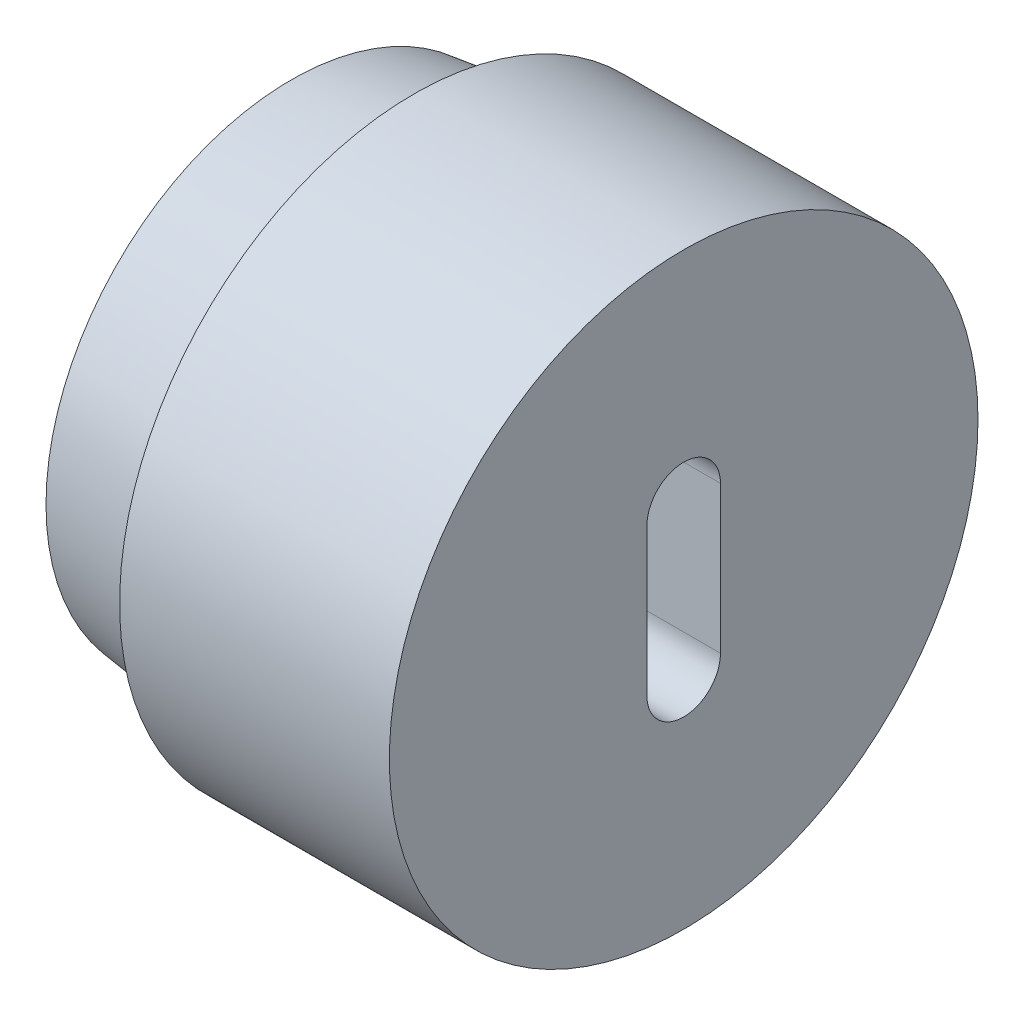
ISO-10303-21;
HEADER;
FILE_DESCRIPTION(('STEP AP214'),'2;1');
FILE_NAME('part.step','',(''),(''),'','','');
FILE_SCHEMA(('AUTOMOTIVE_DESIGN { 1 0 10303 214 1 1 1 1 }'));
ENDSEC;
DATA;
#1=APPLICATION_CONTEXT('core data for automotive mechanical design processes');
#2=APPLICATION_PROTOCOL_DEFINITION('international standard','automotive_design',2000,#1);
#3=PRODUCT_CONTEXT('',#1,'mechanical');
#4=PRODUCT('Part','Part','',(#3));
#5=PRODUCT_RELATED_PRODUCT_CATEGORY('part','',(#4));
#6=PRODUCT_DEFINITION_FORMATION('','',#4);
#7=PRODUCT_DEFINITION_CONTEXT('part definition',#1,'design');
#8=PRODUCT_DEFINITION('design','',#6,#7);
#9=PRODUCT_DEFINITION_SHAPE('','',#8);
#10=(LENGTH_UNIT() NAMED_UNIT(*) SI_UNIT(.MILLI.,.METRE.));
#11=(NAMED_UNIT(*) PLANE_ANGLE_UNIT() SI_UNIT($,.RADIAN.));
#12=(NAMED_UNIT(*) SI_UNIT($,.STERADIAN.) SOLID_ANGLE_UNIT());
#13=UNCERTAINTY_MEASURE_WITH_UNIT(LENGTH_MEASURE(1.E-05),#10,'distance_accuracy_value','');
#14=(GEOMETRIC_REPRESENTATION_CONTEXT(3) GLOBAL_UNCERTAINTY_ASSIGNED_CONTEXT((#13)) GLOBAL_UNIT_ASSIGNED_CONTEXT((#10,
#11,#12)) REPRESENTATION_CONTEXT('',''));
#15=CARTESIAN_POINT('',(0.,0.,0.));
#16=DIRECTION('',(0.,0.,1.));
#17=DIRECTION('',(1.,0.,0.));
#18=AXIS2_PLACEMENT_3D('',#15,#16,#17);
#19=CARTESIAN_POINT('',(0.,0.,0.));
#20=DIRECTION('',(1.,0.,0.));
#21=DIRECTION('',(0.,0.,-1.));
#22=AXIS2_PLACEMENT_3D('',#19,#20,#21);
#23=PLANE('',#22);
#24=CARTESIAN_POINT('',(0.,-1.5,0.));
#25=DIRECTION('',(1.,0.,0.));
#26=DIRECTION('',(0.,0.,-1.));
#27=AXIS2_PLACEMENT_3D('',#24,#25,#26);
#28=CIRCLE('',#27,0.75);
#29=CARTESIAN_POINT('',(0.,-1.5,0.75));
#30=VERTEX_POINT('',#29);
#31=CARTESIAN_POINT('',(0.,-1.5,-0.75));
#32=VERTEX_POINT('',#31);
#33=EDGE_CURVE('E364',#30,#32,#28,.T.);
#34=ORIENTED_EDGE('',*,*,#33,.F.);
#35=DIRECTION('',(0.,-1.,0.));
#36=VECTOR('',#35,1.);
#37=CARTESIAN_POINT('',(0.,-1.5,0.75));
#38=LINE('',#37,#36);
#39=CARTESIAN_POINT('',(0.,1.5,0.75));
#40=VERTEX_POINT('',#39);
#41=EDGE_CURVE('E411',#40,#30,#38,.T.);
#42=ORIENTED_EDGE('',*,*,#41,.F.);
#43=CARTESIAN_POINT('',(0.,1.5,0.));
#44=DIRECTION('',(1.,0.,0.));
#45=DIRECTION('',(0.,0.,-1.));
#46=AXIS2_PLACEMENT_3D('',#43,#44,#45);
#47=CIRCLE('',#46,0.75);
#48=CARTESIAN_POINT('',(0.,1.5,-0.75));
#49=VERTEX_POINT('',#48);
#50=EDGE_CURVE('E395',#49,#40,#47,.T.);
#51=ORIENTED_EDGE('',*,*,#50,.F.);
#52=DIRECTION('',(0.,1.,0.));
#53=VECTOR('',#52,1.);
#54=CARTESIAN_POINT('',(0.,-1.5,-0.75));
#55=LINE('',#54,#53);
#56=EDGE_CURVE('E406',#32,#49,#55,.T.);
#57=ORIENTED_EDGE('',*,*,#56,.F.);
#58=EDGE_LOOP('',(#34,#42,#51,#57));
#59=FACE_BOUND('',#58,.T.);
#60=CARTESIAN_POINT('',(0.,0.,0.));
#61=DIRECTION('',(1.,0.,0.));
#62=DIRECTION('',(0.,0.,-1.));
#63=AXIS2_PLACEMENT_3D('',#60,#61,#62);
#64=CIRCLE('',#63,5.99999999999999);
#65=CARTESIAN_POINT('',(0.,0.,-5.99999999999999));
#66=VERTEX_POINT('',#65);
#67=EDGE_CURVE('E11',#66,#66,#64,.T.);
#68=ORIENTED_EDGE('',*,*,#67,.T.);
#69=EDGE_LOOP('',(#68));
#70=FACE_BOUND('',#69,.T.);
#71=ADVANCED_FACE('F350',(#59,#70),#23,.T.);
#72=CARTESIAN_POINT('',(3.08877382218987,0.,0.));
#73=DIRECTION('',(1.,0.,0.));
#74=DIRECTION('',(0.,0.,-1.));
#75=AXIS2_PLACEMENT_3D('',#72,#73,#74);
#76=CYLINDRICAL_SURFACE('',#75,6.);
#77=CARTESIAN_POINT('',(-5.5,0.,0.));
#78=DIRECTION('',(1.,0.,0.));
#79=DIRECTION('',(0.,0.,-1.));
#80=AXIS2_PLACEMENT_3D('',#77,#78,#79);
#81=CIRCLE('',#80,6.);
#82=CARTESIAN_POINT('',(-5.5,0.,-6.));
#83=VERTEX_POINT('',#82);
#84=EDGE_CURVE('E357',#83,#83,#81,.T.);
#85=ORIENTED_EDGE('',*,*,#84,.T.);
#86=EDGE_LOOP('',(#85));
#87=FACE_BOUND('',#86,.T.);
#88=ORIENTED_EDGE('',*,*,#67,.F.);
#89=EDGE_LOOP('',(#88));
#90=FACE_BOUND('',#89,.T.);
#91=ADVANCED_FACE('F448',(#87,#90),#76,.T.);
#92=CARTESIAN_POINT('',(-5.5,0.,0.));
#93=DIRECTION('',(1.,0.,0.));
#94=DIRECTION('',(0.,0.,-1.));
#95=AXIS2_PLACEMENT_3D('',#92,#93,#94);
#96=CONICAL_SURFACE('',#95,6.,0.98279372324733);
#97=CARTESIAN_POINT('',(-6.,0.,0.));
#98=DIRECTION('',(1.,0.,0.));
#99=DIRECTION('',(0.,0.,-1.));
#100=AXIS2_PLACEMENT_3D('',#97,#98,#99);
#101=CIRCLE('',#100,5.25);
#102=CARTESIAN_POINT('',(-6.,0.,-5.25));
#103=VERTEX_POINT('',#102);
#104=EDGE_CURVE('E443',#103,#103,#101,.T.);
#105=ORIENTED_EDGE('',*,*,#104,.T.);
#106=EDGE_LOOP('',(#105));
#107=FACE_BOUND('',#106,.T.);
#108=ORIENTED_EDGE('',*,*,#84,.F.);
#109=EDGE_LOOP('',(#108));
#110=FACE_BOUND('',#109,.T.);
#111=ADVANCED_FACE('F451',(#107,#110),#96,.T.);
#112=CARTESIAN_POINT('',(-6.,0.,0.));
#113=DIRECTION('',(1.,0.,0.));
#114=DIRECTION('',(0.,0.,-1.));
#115=AXIS2_PLACEMENT_3D('',#112,#113,#114);
#116=CONICAL_SURFACE('',#115,5.25,0.124354994546762);
#117=CARTESIAN_POINT('',(-8.,0.,0.));
#118=DIRECTION('',(1.,0.,0.));
#119=DIRECTION('',(0.,0.,-1.));
#120=AXIS2_PLACEMENT_3D('',#117,#118,#119);
#121=CIRCLE('',#120,5.);
#122=CARTESIAN_POINT('',(-8.,0.,-5.));
#123=VERTEX_POINT('',#122);
#124=EDGE_CURVE('E440',#123,#123,#121,.T.);
#125=ORIENTED_EDGE('',*,*,#124,.T.);
#126=EDGE_LOOP('',(#125));
#127=FACE_BOUND('',#126,.T.);
#128=ORIENTED_EDGE('',*,*,#104,.F.);
#129=EDGE_LOOP('',(#128));
#130=FACE_BOUND('',#129,.T.);
#131=ADVANCED_FACE('F453',(#127,#130),#116,.T.);
#132=CARTESIAN_POINT('',(-8.,5.,0.));
#133=DIRECTION('',(-1.,0.,0.));
#134=DIRECTION('',(0.,0.,1.));
#135=AXIS2_PLACEMENT_3D('',#132,#133,#134);
#136=PLANE('',#135);
#137=CARTESIAN_POINT('',(-8.,0.,0.));
#138=DIRECTION('',(1.,0.,0.));
#139=DIRECTION('',(0.,0.,-1.));
#140=AXIS2_PLACEMENT_3D('',#137,#138,#139);
#141=CIRCLE('',#140,3.62462112512354);
#142=CARTESIAN_POINT('',(-8.,0.,-3.62462112512354));
#143=VERTEX_POINT('',#142);
#144=EDGE_CURVE('E437',#143,#143,#141,.T.);
#145=ORIENTED_EDGE('',*,*,#144,.T.);
#146=EDGE_LOOP('',(#145));
#147=FACE_BOUND('',#146,.T.);
#148=ORIENTED_EDGE('',*,*,#124,.F.);
#149=EDGE_LOOP('',(#148));
#150=FACE_BOUND('',#149,.T.);
#151=ADVANCED_FACE('F460',(#147,#150),#136,.T.);
#152=CARTESIAN_POINT('',(-7.2,0.,0.));
#153=DIRECTION('',(1.,0.,0.));
#154=DIRECTION('',(0.,0.,-1.));
#155=AXIS2_PLACEMENT_3D('',#152,#153,#154);
#156=TOROIDAL_SURFACE('',#155,3.62462112512353,0.8);
#157=CARTESIAN_POINT('',(-7.39402850002906,0.,0.));
#158=DIRECTION('',(1.,0.,0.));
#159=DIRECTION('',(0.,0.,-1.));
#160=AXIS2_PLACEMENT_3D('',#157,#158,#159);
#161=CIRCLE('',#160,2.84850712500726);
#162=CARTESIAN_POINT('',(-7.39402850002906,0.,-2.84850712500726));
#163=VERTEX_POINT('',#162);
#164=EDGE_CURVE('E434',#163,#163,#161,.T.);
#165=ORIENTED_EDGE('',*,*,#164,.T.);
#166=EDGE_LOOP('',(#165));
#167=FACE_BOUND('',#166,.T.);
#168=ORIENTED_EDGE('',*,*,#144,.F.);
#169=EDGE_LOOP('',(#168));
#170=FACE_BOUND('',#169,.T.);
#171=ADVANCED_FACE('F517',(#167,#170),#156,.T.);
#172=CARTESIAN_POINT('',(-7.39402850002906,0.,0.));
#173=DIRECTION('',(-1.,0.,0.));
#174=DIRECTION('',(0.,0.,1.));
#175=AXIS2_PLACEMENT_3D('',#172,#173,#174);
#176=CONICAL_SURFACE('',#175,2.84850712500726,0.244978663126864);
#177=CARTESIAN_POINT('',(-6.30298574998547,0.,0.));
#178=DIRECTION('',(1.,0.,0.));
#179=DIRECTION('',(0.,0.,-1.));
#180=AXIS2_PLACEMENT_3D('',#177,#178,#179);
#181=CIRCLE('',#180,2.57574643749637);
#182=CARTESIAN_POINT('',(-6.30298574998547,0.,-2.57574643749637));
#183=VERTEX_POINT('',#182);
#184=EDGE_CURVE('E431',#183,#183,#181,.T.);
#185=ORIENTED_EDGE('',*,*,#184,.T.);
#186=EDGE_LOOP('',(#185));
#187=FACE_BOUND('',#186,.T.);
#188=ORIENTED_EDGE('',*,*,#164,.F.);
#189=EDGE_LOOP('',(#188));
#190=FACE_BOUND('',#189,.T.);
#191=ADVANCED_FACE('F513',(#187,#190),#176,.F.);
#192=CARTESIAN_POINT('',(-6.4,0.,0.));
#193=DIRECTION('',(1.,0.,0.));
#194=DIRECTION('',(0.,0.,-1.));
#195=AXIS2_PLACEMENT_3D('',#192,#193,#194);
#196=TOROIDAL_SURFACE('',#195,2.18768943743823,0.4);
#197=CARTESIAN_POINT('',(-6.,0.,0.));
#198=DIRECTION('',(1.,0.,0.));
#199=DIRECTION('',(0.,0.,-1.));
#200=AXIS2_PLACEMENT_3D('',#197,#198,#199);
#201=CIRCLE('',#200,2.18768943743823);
#202=CARTESIAN_POINT('',(-6.,0.,-2.18768943743823));
#203=VERTEX_POINT('',#202);
#204=EDGE_CURVE('E426',#203,#203,#201,.T.);
#205=ORIENTED_EDGE('',*,*,#204,.T.);
#206=EDGE_LOOP('',(#205));
#207=FACE_BOUND('',#206,.T.);
#208=ORIENTED_EDGE('',*,*,#184,.F.);
#209=EDGE_LOOP('',(#208));
#210=FACE_BOUND('',#209,.T.);
#211=ADVANCED_FACE('F510',(#207,#210),#196,.F.);
#212=CARTESIAN_POINT('',(-6.,2.18768943743823,0.));
#213=DIRECTION('',(-1.,0.,0.));
#214=DIRECTION('',(0.,0.,1.));
#215=AXIS2_PLACEMENT_3D('',#212,#213,#214);
#216=PLANE('',#215);
#217=ORIENTED_EDGE('',*,*,#204,.F.);
#218=EDGE_LOOP('',(#217));
#219=FACE_BOUND('',#218,.T.);
#220=ADVANCED_FACE('F471',(#219),#216,.T.);
#221=CARTESIAN_POINT('',(-2.,-1.5,0.));
#222=DIRECTION('',(1.,0.,0.));
#223=DIRECTION('',(0.,0.,-1.));
#224=AXIS2_PLACEMENT_3D('',#221,#222,#223);
#225=CYLINDRICAL_SURFACE('',#224,0.75);
#226=ORIENTED_EDGE('',*,*,#33,.T.);
#227=DIRECTION('',(1.,0.,0.));
#228=VECTOR('',#227,1.);
#229=CARTESIAN_POINT('',(-2.,-1.5,-0.75));
#230=LINE('',#229,#228);
#231=CARTESIAN_POINT('',(-2.,-1.5,-0.75));
#232=VERTEX_POINT('',#231);
#233=EDGE_CURVE('E403',#232,#32,#230,.T.);
#234=ORIENTED_EDGE('',*,*,#233,.F.);
#235=CARTESIAN_POINT('',(-2.,-1.5,0.));
#236=DIRECTION('',(1.,0.,0.));
#237=DIRECTION('',(0.,0.,-1.));
#238=AXIS2_PLACEMENT_3D('',#235,#236,#237);
#239=CIRCLE('',#238,0.75);
#240=CARTESIAN_POINT('',(-2.,-1.5,0.75));
#241=VERTEX_POINT('',#240);
#242=EDGE_CURVE('E413',#241,#232,#239,.T.);
#243=ORIENTED_EDGE('',*,*,#242,.F.);
#244=DIRECTION('',(1.,0.,0.));
#245=VECTOR('',#244,1.);
#246=CARTESIAN_POINT('',(-2.,-1.5,0.75));
#247=LINE('',#246,#245);
#248=EDGE_CURVE('E371',#241,#30,#247,.T.);
#249=ORIENTED_EDGE('',*,*,#248,.T.);
#250=EDGE_LOOP('',(#226,#234,#243,#249));
#251=FACE_BOUND('',#250,.T.);
#252=ADVANCED_FACE('F475',(#251),#225,.F.);
#253=CARTESIAN_POINT('',(-2.,-1.5,0.75));
#254=DIRECTION('',(0.,0.,1.));
#255=DIRECTION('',(1.,0.,0.));
#256=AXIS2_PLACEMENT_3D('',#253,#254,#255);
#257=PLANE('',#256);
#258=ORIENTED_EDGE('',*,*,#41,.T.);
#259=ORIENTED_EDGE('',*,*,#248,.F.);
#260=DIRECTION('',(0.,-1.,0.));
#261=VECTOR('',#260,1.);
#262=CARTESIAN_POINT('',(-2.,-1.5,0.75));
#263=LINE('',#262,#261);
#264=CARTESIAN_POINT('',(-2.,1.5,0.75));
#265=VERTEX_POINT('',#264);
#266=EDGE_CURVE('E422',#265,#241,#263,.T.);
#267=ORIENTED_EDGE('',*,*,#266,.F.);
#268=DIRECTION('',(1.,0.,0.));
#269=VECTOR('',#268,1.);
#270=CARTESIAN_POINT('',(-2.,1.5,0.75));
#271=LINE('',#270,#269);
#272=EDGE_CURVE('E402',#265,#40,#271,.T.);
#273=ORIENTED_EDGE('',*,*,#272,.T.);
#274=EDGE_LOOP('',(#258,#259,#267,#273));
#275=FACE_BOUND('',#274,.T.);
#276=ADVANCED_FACE('F479',(#275),#257,.F.);
#277=CARTESIAN_POINT('',(-2.,1.5,0.));
#278=DIRECTION('',(1.,0.,0.));
#279=DIRECTION('',(0.,0.,-1.));
#280=AXIS2_PLACEMENT_3D('',#277,#278,#279);
#281=CYLINDRICAL_SURFACE('',#280,0.75);
#282=ORIENTED_EDGE('',*,*,#50,.T.);
#283=ORIENTED_EDGE('',*,*,#272,.F.);
#284=CARTESIAN_POINT('',(-2.,1.5,0.));
#285=DIRECTION('',(1.,0.,0.));
#286=DIRECTION('',(0.,0.,-1.));
#287=AXIS2_PLACEMENT_3D('',#284,#285,#286);
#288=CIRCLE('',#287,0.75);
#289=CARTESIAN_POINT('',(-2.,1.5,-0.75));
#290=VERTEX_POINT('',#289);
#291=EDGE_CURVE('E398',#290,#265,#288,.T.);
#292=ORIENTED_EDGE('',*,*,#291,.F.);
#293=DIRECTION('',(1.,0.,0.));
#294=VECTOR('',#293,1.);
#295=CARTESIAN_POINT('',(-2.,1.5,-0.75));
#296=LINE('',#295,#294);
#297=EDGE_CURVE('E391',#290,#49,#296,.T.);
#298=ORIENTED_EDGE('',*,*,#297,.T.);
#299=EDGE_LOOP('',(#282,#283,#292,#298));
#300=FACE_BOUND('',#299,.T.);
#301=ADVANCED_FACE('F393',(#300),#281,.F.);
#302=CARTESIAN_POINT('',(-2.,-1.5,-0.75));
#303=DIRECTION('',(0.,0.,-1.));
#304=DIRECTION('',(-1.,0.,0.));
#305=AXIS2_PLACEMENT_3D('',#302,#303,#304);
#306=PLANE('',#305);
#307=ORIENTED_EDGE('',*,*,#56,.T.);
#308=ORIENTED_EDGE('',*,*,#297,.F.);
#309=DIRECTION('',(0.,1.,0.));
#310=VECTOR('',#309,1.);
#311=CARTESIAN_POINT('',(-2.,-1.5,-0.75));
#312=LINE('',#311,#310);
#313=EDGE_CURVE('E419',#232,#290,#312,.T.);
#314=ORIENTED_EDGE('',*,*,#313,.F.);
#315=ORIENTED_EDGE('',*,*,#233,.T.);
#316=EDGE_LOOP('',(#307,#308,#314,#315));
#317=FACE_BOUND('',#316,.T.);
#318=ADVANCED_FACE('F407',(#317),#306,.F.);
#319=CARTESIAN_POINT('',(-2.,-1.5,0.));
#320=DIRECTION('',(1.,0.,0.));
#321=DIRECTION('',(0.,0.,-1.));
#322=AXIS2_PLACEMENT_3D('',#319,#320,#321);
#323=PLANE('',#322);
#324=ORIENTED_EDGE('',*,*,#242,.T.);
#325=ORIENTED_EDGE('',*,*,#313,.T.);
#326=ORIENTED_EDGE('',*,*,#291,.T.);
#327=ORIENTED_EDGE('',*,*,#266,.T.);
#328=EDGE_LOOP('',(#324,#325,#326,#327));
#329=FACE_BOUND('',#328,.T.);
#330=ADVANCED_FACE('F498',(#329),#323,.T.);
#331=CLOSED_SHELL('',(#71,#91,#111,#131,#151,#171,#191,#211,#220,#252,#276,#301,#318,#330));
#332=MANIFOLD_SOLID_BREP('B2',#331);
#333=ADVANCED_BREP_SHAPE_REPRESENTATION('',(#18,#332),#14);
#334=SHAPE_DEFINITION_REPRESENTATION(#9,#333);
ENDSEC;
END-ISO-10303-21;
